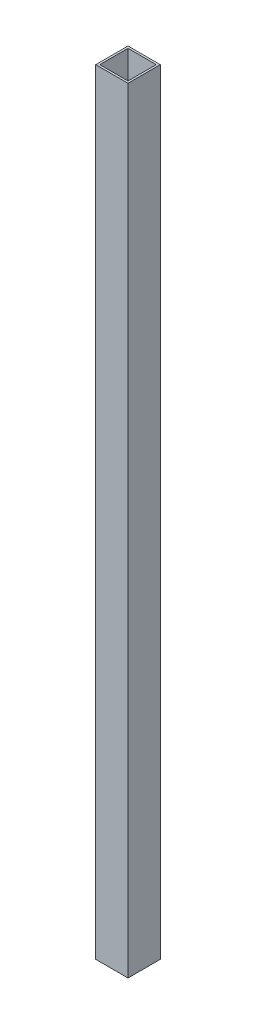
ISO-10303-21;
HEADER;
FILE_DESCRIPTION(('STEP AP214'),'2;1');
FILE_NAME('part.step','',(''),(''),'','','');
FILE_SCHEMA(('AUTOMOTIVE_DESIGN { 1 0 10303 214 1 1 1 1 }'));
ENDSEC;
DATA;
#1=APPLICATION_CONTEXT('core data for automotive mechanical design processes');
#2=APPLICATION_PROTOCOL_DEFINITION('international standard','automotive_design',2000,#1);
#3=PRODUCT_CONTEXT('',#1,'mechanical');
#4=PRODUCT('Part','Part','',(#3));
#5=PRODUCT_RELATED_PRODUCT_CATEGORY('part','',(#4));
#6=PRODUCT_DEFINITION_FORMATION('','',#4);
#7=PRODUCT_DEFINITION_CONTEXT('part definition',#1,'design');
#8=PRODUCT_DEFINITION('design','',#6,#7);
#9=PRODUCT_DEFINITION_SHAPE('','',#8);
#10=(LENGTH_UNIT() NAMED_UNIT(*) SI_UNIT(.MILLI.,.METRE.));
#11=(NAMED_UNIT(*) PLANE_ANGLE_UNIT() SI_UNIT($,.RADIAN.));
#12=(NAMED_UNIT(*) SI_UNIT($,.STERADIAN.) SOLID_ANGLE_UNIT());
#13=UNCERTAINTY_MEASURE_WITH_UNIT(LENGTH_MEASURE(1.E-05),#10,'distance_accuracy_value','');
#14=(GEOMETRIC_REPRESENTATION_CONTEXT(3) GLOBAL_UNCERTAINTY_ASSIGNED_CONTEXT((#13)) GLOBAL_UNIT_ASSIGNED_CONTEXT((#10,
#11,#12)) REPRESENTATION_CONTEXT('',''));
#15=CARTESIAN_POINT('',(0.,0.,0.));
#16=DIRECTION('',(0.,0.,1.));
#17=DIRECTION('',(1.,0.,0.));
#18=AXIS2_PLACEMENT_3D('',#15,#16,#17);
#19=CARTESIAN_POINT('',(0.,609.6,0.));
#20=DIRECTION('',(0.,-1.,0.));
#21=DIRECTION('',(0.,0.,-1.));
#22=AXIS2_PLACEMENT_3D('',#19,#20,#21);
#23=PLANE('',#22);
#24=DIRECTION('',(0.,0.,1.));
#25=VECTOR('',#24,1.);
#26=CARTESIAN_POINT('',(-12.7,609.6,-12.7));
#27=LINE('',#26,#25);
#28=CARTESIAN_POINT('',(-12.7,609.6,-12.7));
#29=VERTEX_POINT('',#28);
#30=CARTESIAN_POINT('',(-12.7,609.6,12.7));
#31=VERTEX_POINT('',#30);
#32=EDGE_CURVE('E134',#29,#31,#27,.T.);
#33=ORIENTED_EDGE('',*,*,#32,.T.);
#34=DIRECTION('',(1.,0.,0.));
#35=VECTOR('',#34,1.);
#36=CARTESIAN_POINT('',(12.7,609.6,12.7));
#37=LINE('',#36,#35);
#38=CARTESIAN_POINT('',(12.7,609.6,12.7));
#39=VERTEX_POINT('',#38);
#40=EDGE_CURVE('E137',#31,#39,#37,.T.);
#41=ORIENTED_EDGE('',*,*,#40,.T.);
#42=DIRECTION('',(0.,0.,-1.));
#43=VECTOR('',#42,1.);
#44=CARTESIAN_POINT('',(12.7,609.6,-12.7));
#45=LINE('',#44,#43);
#46=CARTESIAN_POINT('',(12.7,609.6,-12.7));
#47=VERTEX_POINT('',#46);
#48=EDGE_CURVE('E140',#39,#47,#45,.T.);
#49=ORIENTED_EDGE('',*,*,#48,.T.);
#50=DIRECTION('',(-1.,0.,0.));
#51=VECTOR('',#50,1.);
#52=CARTESIAN_POINT('',(12.7,609.6,-12.7));
#53=LINE('',#52,#51);
#54=EDGE_CURVE('E142',#47,#29,#53,.T.);
#55=ORIENTED_EDGE('',*,*,#54,.T.);
#56=EDGE_LOOP('',(#33,#41,#49,#55));
#57=FACE_BOUND('',#56,.T.);
#58=DIRECTION('',(0.,0.,1.));
#59=VECTOR('',#58,1.);
#60=CARTESIAN_POINT('',(-11.1125,609.6,-11.1125));
#61=LINE('',#60,#59);
#62=CARTESIAN_POINT('',(-11.1125,609.6,-11.1125));
#63=VERTEX_POINT('',#62);
#64=CARTESIAN_POINT('',(-11.1125,609.6,11.1125));
#65=VERTEX_POINT('',#64);
#66=EDGE_CURVE('E98',#63,#65,#61,.T.);
#67=ORIENTED_EDGE('',*,*,#66,.F.);
#68=DIRECTION('',(-1.,0.,0.));
#69=VECTOR('',#68,1.);
#70=CARTESIAN_POINT('',(11.1125,609.6,-11.1125));
#71=LINE('',#70,#69);
#72=CARTESIAN_POINT('',(11.1125,609.6,-11.1125));
#73=VERTEX_POINT('',#72);
#74=EDGE_CURVE('E120',#73,#63,#71,.T.);
#75=ORIENTED_EDGE('',*,*,#74,.F.);
#76=DIRECTION('',(0.,0.,-1.));
#77=VECTOR('',#76,1.);
#78=CARTESIAN_POINT('',(11.1125,609.6,-11.1125));
#79=LINE('',#78,#77);
#80=CARTESIAN_POINT('',(11.1125,609.6,11.1125));
#81=VERTEX_POINT('',#80);
#82=EDGE_CURVE('E118',#81,#73,#79,.T.);
#83=ORIENTED_EDGE('',*,*,#82,.F.);
#84=DIRECTION('',(1.,0.,0.));
#85=VECTOR('',#84,1.);
#86=CARTESIAN_POINT('',(11.1125,609.6,11.1125));
#87=LINE('',#86,#85);
#88=EDGE_CURVE('E106',#65,#81,#87,.T.);
#89=ORIENTED_EDGE('',*,*,#88,.F.);
#90=EDGE_LOOP('',(#67,#75,#83,#89));
#91=FACE_BOUND('',#90,.T.);
#92=ADVANCED_FACE('F33',(#57,#91),#23,.F.);
#93=CARTESIAN_POINT('',(0.,0.,0.));
#94=DIRECTION('',(0.,-1.,0.));
#95=DIRECTION('',(0.,0.,-1.));
#96=AXIS2_PLACEMENT_3D('',#93,#94,#95);
#97=PLANE('',#96);
#98=DIRECTION('',(0.,0.,1.));
#99=VECTOR('',#98,1.);
#100=CARTESIAN_POINT('',(-12.7,0.,-12.7));
#101=LINE('',#100,#99);
#102=CARTESIAN_POINT('',(-12.7,0.,-12.7));
#103=VERTEX_POINT('',#102);
#104=CARTESIAN_POINT('',(-12.7,0.,12.7));
#105=VERTEX_POINT('',#104);
#106=EDGE_CURVE('E114',#103,#105,#101,.T.);
#107=ORIENTED_EDGE('',*,*,#106,.F.);
#108=DIRECTION('',(-1.,0.,0.));
#109=VECTOR('',#108,1.);
#110=CARTESIAN_POINT('',(12.7,0.,-12.7));
#111=LINE('',#110,#109);
#112=CARTESIAN_POINT('',(12.7,0.,-12.7));
#113=VERTEX_POINT('',#112);
#114=EDGE_CURVE('E138',#113,#103,#111,.T.);
#115=ORIENTED_EDGE('',*,*,#114,.F.);
#116=DIRECTION('',(0.,0.,-1.));
#117=VECTOR('',#116,1.);
#118=CARTESIAN_POINT('',(12.7,0.,-12.7));
#119=LINE('',#118,#117);
#120=CARTESIAN_POINT('',(12.7,0.,12.7));
#121=VERTEX_POINT('',#120);
#122=EDGE_CURVE('E149',#121,#113,#119,.T.);
#123=ORIENTED_EDGE('',*,*,#122,.F.);
#124=DIRECTION('',(1.,0.,0.));
#125=VECTOR('',#124,1.);
#126=CARTESIAN_POINT('',(12.7,0.,12.7));
#127=LINE('',#126,#125);
#128=EDGE_CURVE('E147',#105,#121,#127,.T.);
#129=ORIENTED_EDGE('',*,*,#128,.F.);
#130=EDGE_LOOP('',(#107,#115,#123,#129));
#131=FACE_BOUND('',#130,.T.);
#132=DIRECTION('',(-1.,0.,0.));
#133=VECTOR('',#132,1.);
#134=CARTESIAN_POINT('',(11.1125,0.,-11.1125));
#135=LINE('',#134,#133);
#136=CARTESIAN_POINT('',(11.1125,0.,-11.1125));
#137=VERTEX_POINT('',#136);
#138=CARTESIAN_POINT('',(-11.1125,0.,-11.1125));
#139=VERTEX_POINT('',#138);
#140=EDGE_CURVE('E107',#137,#139,#135,.T.);
#141=ORIENTED_EDGE('',*,*,#140,.T.);
#142=DIRECTION('',(0.,0.,1.));
#143=VECTOR('',#142,1.);
#144=CARTESIAN_POINT('',(-11.1125,0.,-11.1125));
#145=LINE('',#144,#143);
#146=CARTESIAN_POINT('',(-11.1125,0.,11.1125));
#147=VERTEX_POINT('',#146);
#148=EDGE_CURVE('E56',#139,#147,#145,.T.);
#149=ORIENTED_EDGE('',*,*,#148,.T.);
#150=DIRECTION('',(1.,0.,0.));
#151=VECTOR('',#150,1.);
#152=CARTESIAN_POINT('',(11.1125,0.,11.1125));
#153=LINE('',#152,#151);
#154=CARTESIAN_POINT('',(11.1125,0.,11.1125));
#155=VERTEX_POINT('',#154);
#156=EDGE_CURVE('E113',#147,#155,#153,.T.);
#157=ORIENTED_EDGE('',*,*,#156,.T.);
#158=DIRECTION('',(0.,0.,-1.));
#159=VECTOR('',#158,1.);
#160=CARTESIAN_POINT('',(11.1125,0.,-11.1125));
#161=LINE('',#160,#159);
#162=EDGE_CURVE('E126',#155,#137,#161,.T.);
#163=ORIENTED_EDGE('',*,*,#162,.T.);
#164=EDGE_LOOP('',(#141,#149,#157,#163));
#165=FACE_BOUND('',#164,.T.);
#166=ADVANCED_FACE('F167',(#131,#165),#97,.T.);
#167=CARTESIAN_POINT('',(-12.7,609.6,-12.7));
#168=DIRECTION('',(1.,0.,0.));
#169=DIRECTION('',(0.,0.,-1.));
#170=AXIS2_PLACEMENT_3D('',#167,#168,#169);
#171=PLANE('',#170);
#172=ORIENTED_EDGE('',*,*,#106,.T.);
#173=DIRECTION('',(0.,-1.,0.));
#174=VECTOR('',#173,1.);
#175=CARTESIAN_POINT('',(-12.7,609.6,12.7));
#176=LINE('',#175,#174);
#177=EDGE_CURVE('E11',#31,#105,#176,.T.);
#178=ORIENTED_EDGE('',*,*,#177,.F.);
#179=ORIENTED_EDGE('',*,*,#32,.F.);
#180=DIRECTION('',(0.,-1.,0.));
#181=VECTOR('',#180,1.);
#182=CARTESIAN_POINT('',(-12.7,609.6,-12.7));
#183=LINE('',#182,#181);
#184=EDGE_CURVE('E144',#29,#103,#183,.T.);
#185=ORIENTED_EDGE('',*,*,#184,.T.);
#186=EDGE_LOOP('',(#172,#178,#179,#185));
#187=FACE_BOUND('',#186,.T.);
#188=ADVANCED_FACE('F35',(#187),#171,.F.);
#189=CARTESIAN_POINT('',(12.7,609.6,12.7));
#190=DIRECTION('',(0.,0.,-1.));
#191=DIRECTION('',(-1.,0.,0.));
#192=AXIS2_PLACEMENT_3D('',#189,#190,#191);
#193=PLANE('',#192);
#194=ORIENTED_EDGE('',*,*,#128,.T.);
#195=DIRECTION('',(0.,-1.,0.));
#196=VECTOR('',#195,1.);
#197=CARTESIAN_POINT('',(12.7,609.6,12.7));
#198=LINE('',#197,#196);
#199=EDGE_CURVE('E41',#39,#121,#198,.T.);
#200=ORIENTED_EDGE('',*,*,#199,.F.);
#201=ORIENTED_EDGE('',*,*,#40,.F.);
#202=ORIENTED_EDGE('',*,*,#177,.T.);
#203=EDGE_LOOP('',(#194,#200,#201,#202));
#204=FACE_BOUND('',#203,.T.);
#205=ADVANCED_FACE('F177',(#204),#193,.F.);
#206=CARTESIAN_POINT('',(12.7,609.6,-12.7));
#207=DIRECTION('',(-1.,0.,0.));
#208=DIRECTION('',(0.,0.,1.));
#209=AXIS2_PLACEMENT_3D('',#206,#207,#208);
#210=PLANE('',#209);
#211=ORIENTED_EDGE('',*,*,#122,.T.);
#212=DIRECTION('',(0.,-1.,0.));
#213=VECTOR('',#212,1.);
#214=CARTESIAN_POINT('',(12.7,609.6,-12.7));
#215=LINE('',#214,#213);
#216=EDGE_CURVE('E154',#47,#113,#215,.T.);
#217=ORIENTED_EDGE('',*,*,#216,.F.);
#218=ORIENTED_EDGE('',*,*,#48,.F.);
#219=ORIENTED_EDGE('',*,*,#199,.T.);
#220=EDGE_LOOP('',(#211,#217,#218,#219));
#221=FACE_BOUND('',#220,.T.);
#222=ADVANCED_FACE('F161',(#221),#210,.F.);
#223=CARTESIAN_POINT('',(12.7,609.6,-12.7));
#224=DIRECTION('',(0.,0.,1.));
#225=DIRECTION('',(1.,0.,0.));
#226=AXIS2_PLACEMENT_3D('',#223,#224,#225);
#227=PLANE('',#226);
#228=ORIENTED_EDGE('',*,*,#114,.T.);
#229=ORIENTED_EDGE('',*,*,#184,.F.);
#230=ORIENTED_EDGE('',*,*,#54,.F.);
#231=ORIENTED_EDGE('',*,*,#216,.T.);
#232=EDGE_LOOP('',(#228,#229,#230,#231));
#233=FACE_BOUND('',#232,.T.);
#234=ADVANCED_FACE('F171',(#233),#227,.F.);
#235=CARTESIAN_POINT('',(-11.1125,609.6,-11.1125));
#236=DIRECTION('',(1.,0.,0.));
#237=DIRECTION('',(0.,0.,-1.));
#238=AXIS2_PLACEMENT_3D('',#235,#236,#237);
#239=PLANE('',#238);
#240=ORIENTED_EDGE('',*,*,#148,.F.);
#241=DIRECTION('',(0.,-1.,0.));
#242=VECTOR('',#241,1.);
#243=CARTESIAN_POINT('',(-11.1125,609.6,-11.1125));
#244=LINE('',#243,#242);
#245=EDGE_CURVE('E102',#63,#139,#244,.T.);
#246=ORIENTED_EDGE('',*,*,#245,.F.);
#247=ORIENTED_EDGE('',*,*,#66,.T.);
#248=DIRECTION('',(0.,-1.,0.));
#249=VECTOR('',#248,1.);
#250=CARTESIAN_POINT('',(-11.1125,609.6,11.1125));
#251=LINE('',#250,#249);
#252=EDGE_CURVE('E101',#65,#147,#251,.T.);
#253=ORIENTED_EDGE('',*,*,#252,.T.);
#254=EDGE_LOOP('',(#240,#246,#247,#253));
#255=FACE_BOUND('',#254,.T.);
#256=ADVANCED_FACE('F100',(#255),#239,.T.);
#257=CARTESIAN_POINT('',(11.1125,609.6,11.1125));
#258=DIRECTION('',(0.,0.,-1.));
#259=DIRECTION('',(-1.,0.,0.));
#260=AXIS2_PLACEMENT_3D('',#257,#258,#259);
#261=PLANE('',#260);
#262=ORIENTED_EDGE('',*,*,#156,.F.);
#263=ORIENTED_EDGE('',*,*,#252,.F.);
#264=ORIENTED_EDGE('',*,*,#88,.T.);
#265=DIRECTION('',(0.,-1.,0.));
#266=VECTOR('',#265,1.);
#267=CARTESIAN_POINT('',(11.1125,609.6,11.1125));
#268=LINE('',#267,#266);
#269=EDGE_CURVE('E115',#81,#155,#268,.T.);
#270=ORIENTED_EDGE('',*,*,#269,.T.);
#271=EDGE_LOOP('',(#262,#263,#264,#270));
#272=FACE_BOUND('',#271,.T.);
#273=ADVANCED_FACE('F110',(#272),#261,.T.);
#274=CARTESIAN_POINT('',(11.1125,609.6,-11.1125));
#275=DIRECTION('',(-1.,0.,0.));
#276=DIRECTION('',(0.,0.,1.));
#277=AXIS2_PLACEMENT_3D('',#274,#275,#276);
#278=PLANE('',#277);
#279=ORIENTED_EDGE('',*,*,#162,.F.);
#280=ORIENTED_EDGE('',*,*,#269,.F.);
#281=ORIENTED_EDGE('',*,*,#82,.T.);
#282=DIRECTION('',(0.,-1.,0.));
#283=VECTOR('',#282,1.);
#284=CARTESIAN_POINT('',(11.1125,609.6,-11.1125));
#285=LINE('',#284,#283);
#286=EDGE_CURVE('E48',#73,#137,#285,.T.);
#287=ORIENTED_EDGE('',*,*,#286,.T.);
#288=EDGE_LOOP('',(#279,#280,#281,#287));
#289=FACE_BOUND('',#288,.T.);
#290=ADVANCED_FACE('F200',(#289),#278,.T.);
#291=CARTESIAN_POINT('',(11.1125,609.6,-11.1125));
#292=DIRECTION('',(0.,0.,1.));
#293=DIRECTION('',(1.,0.,0.));
#294=AXIS2_PLACEMENT_3D('',#291,#292,#293);
#295=PLANE('',#294);
#296=ORIENTED_EDGE('',*,*,#140,.F.);
#297=ORIENTED_EDGE('',*,*,#286,.F.);
#298=ORIENTED_EDGE('',*,*,#74,.T.);
#299=ORIENTED_EDGE('',*,*,#245,.T.);
#300=EDGE_LOOP('',(#296,#297,#298,#299));
#301=FACE_BOUND('',#300,.T.);
#302=ADVANCED_FACE('F204',(#301),#295,.T.);
#303=CLOSED_SHELL('',(#92,#166,#188,#205,#222,#234,#256,#273,#290,#302));
#304=MANIFOLD_SOLID_BREP('B2',#303);
#305=ADVANCED_BREP_SHAPE_REPRESENTATION('',(#18,#304),#14);
#306=SHAPE_DEFINITION_REPRESENTATION(#9,#305);
ENDSEC;
END-ISO-10303-21;
